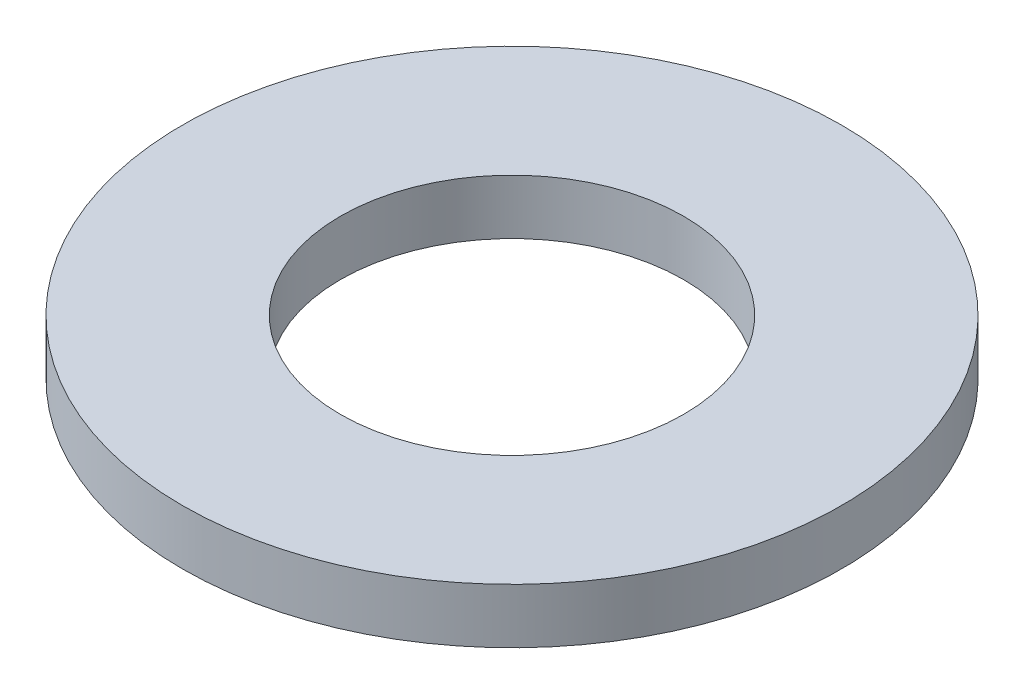
ISO-10303-21;
HEADER;
FILE_DESCRIPTION(('STEP AP214'),'2;1');
FILE_NAME('part.step','',(''),(''),'','','');
FILE_SCHEMA(('AUTOMOTIVE_DESIGN { 1 0 10303 214 1 1 1 1 }'));
ENDSEC;
DATA;
#1=APPLICATION_CONTEXT('core data for automotive mechanical design processes');
#2=APPLICATION_PROTOCOL_DEFINITION('international standard','automotive_design',2000,#1);
#3=PRODUCT_CONTEXT('',#1,'mechanical');
#4=PRODUCT('Part','Part','',(#3));
#5=PRODUCT_RELATED_PRODUCT_CATEGORY('part','',(#4));
#6=PRODUCT_DEFINITION_FORMATION('','',#4);
#7=PRODUCT_DEFINITION_CONTEXT('part definition',#1,'design');
#8=PRODUCT_DEFINITION('design','',#6,#7);
#9=PRODUCT_DEFINITION_SHAPE('','',#8);
#10=(LENGTH_UNIT() NAMED_UNIT(*) SI_UNIT(.MILLI.,.METRE.));
#11=(NAMED_UNIT(*) PLANE_ANGLE_UNIT() SI_UNIT($,.RADIAN.));
#12=(NAMED_UNIT(*) SI_UNIT($,.STERADIAN.) SOLID_ANGLE_UNIT());
#13=UNCERTAINTY_MEASURE_WITH_UNIT(LENGTH_MEASURE(1.E-05),#10,'distance_accuracy_value','');
#14=(GEOMETRIC_REPRESENTATION_CONTEXT(3) GLOBAL_UNCERTAINTY_ASSIGNED_CONTEXT((#13)) GLOBAL_UNIT_ASSIGNED_CONTEXT((#10,
#11,#12)) REPRESENTATION_CONTEXT('',''));
#15=CARTESIAN_POINT('',(0.,0.,0.));
#16=DIRECTION('',(0.,0.,1.));
#17=DIRECTION('',(1.,0.,0.));
#18=AXIS2_PLACEMENT_3D('',#15,#16,#17);
#19=CARTESIAN_POINT('',(0.,1.,0.));
#20=DIRECTION('',(0.,1.,0.));
#21=DIRECTION('',(0.,0.,1.));
#22=AXIS2_PLACEMENT_3D('',#19,#20,#21);
#23=PLANE('',#22);
#24=CARTESIAN_POINT('',(0.,1.,0.));
#25=DIRECTION('',(0.,1.,0.));
#26=DIRECTION('',(0.,0.,1.));
#27=AXIS2_PLACEMENT_3D('',#24,#25,#26);
#28=CIRCLE('',#27,6.);
#29=CARTESIAN_POINT('',(0.,1.,6.));
#30=VERTEX_POINT('',#29);
#31=EDGE_CURVE('E10',#30,#30,#28,.T.);
#32=ORIENTED_EDGE('',*,*,#31,.T.);
#33=EDGE_LOOP('',(#32));
#34=FACE_BOUND('',#33,.T.);
#35=CARTESIAN_POINT('',(0.,1.,0.));
#36=DIRECTION('',(0.,1.,0.));
#37=DIRECTION('',(0.,0.,1.));
#38=AXIS2_PLACEMENT_3D('',#35,#36,#37);
#39=CIRCLE('',#38,3.125);
#40=CARTESIAN_POINT('',(0.,1.,3.125));
#41=VERTEX_POINT('',#40);
#42=EDGE_CURVE('E56',#41,#41,#39,.T.);
#43=ORIENTED_EDGE('',*,*,#42,.F.);
#44=EDGE_LOOP('',(#43));
#45=FACE_BOUND('',#44,.T.);
#46=ADVANCED_FACE('F43',(#34,#45),#23,.T.);
#47=CARTESIAN_POINT('',(0.,0.,0.));
#48=DIRECTION('',(0.,1.,0.));
#49=DIRECTION('',(0.,0.,1.));
#50=AXIS2_PLACEMENT_3D('',#47,#48,#49);
#51=PLANE('',#50);
#52=CARTESIAN_POINT('',(0.,0.,0.));
#53=DIRECTION('',(0.,1.,0.));
#54=DIRECTION('',(0.,0.,1.));
#55=AXIS2_PLACEMENT_3D('',#52,#53,#54);
#56=CIRCLE('',#55,6.);
#57=CARTESIAN_POINT('',(0.,0.,6.));
#58=VERTEX_POINT('',#57);
#59=EDGE_CURVE('E47',#58,#58,#56,.T.);
#60=ORIENTED_EDGE('',*,*,#59,.F.);
#61=EDGE_LOOP('',(#60));
#62=FACE_BOUND('',#61,.T.);
#63=CARTESIAN_POINT('',(0.,0.,0.));
#64=DIRECTION('',(0.,1.,0.));
#65=DIRECTION('',(0.,0.,1.));
#66=AXIS2_PLACEMENT_3D('',#63,#64,#65);
#67=CIRCLE('',#66,3.125);
#68=CARTESIAN_POINT('',(0.,0.,3.125));
#69=VERTEX_POINT('',#68);
#70=EDGE_CURVE('E58',#69,#69,#67,.T.);
#71=ORIENTED_EDGE('',*,*,#70,.T.);
#72=EDGE_LOOP('',(#71));
#73=FACE_BOUND('',#72,.T.);
#74=ADVANCED_FACE('F70',(#62,#73),#51,.F.);
#75=CARTESIAN_POINT('',(0.,1.,0.));
#76=DIRECTION('',(0.,-1.,0.));
#77=DIRECTION('',(0.,0.,-1.));
#78=AXIS2_PLACEMENT_3D('',#75,#76,#77);
#79=CYLINDRICAL_SURFACE('',#78,6.);
#80=ORIENTED_EDGE('',*,*,#31,.F.);
#81=EDGE_LOOP('',(#80));
#82=FACE_BOUND('',#81,.T.);
#83=ORIENTED_EDGE('',*,*,#59,.T.);
#84=EDGE_LOOP('',(#83));
#85=FACE_BOUND('',#84,.T.);
#86=ADVANCED_FACE('F45',(#82,#85),#79,.T.);
#87=CARTESIAN_POINT('',(0.,1.,0.));
#88=DIRECTION('',(0.,-1.,0.));
#89=DIRECTION('',(0.,0.,-1.));
#90=AXIS2_PLACEMENT_3D('',#87,#88,#89);
#91=CYLINDRICAL_SURFACE('',#90,3.125);
#92=ORIENTED_EDGE('',*,*,#42,.T.);
#93=EDGE_LOOP('',(#92));
#94=FACE_BOUND('',#93,.T.);
#95=ORIENTED_EDGE('',*,*,#70,.F.);
#96=EDGE_LOOP('',(#95));
#97=FACE_BOUND('',#96,.T.);
#98=ADVANCED_FACE('F66',(#94,#97),#91,.F.);
#99=CLOSED_SHELL('',(#46,#74,#86,#98));
#100=MANIFOLD_SOLID_BREP('B2',#99);
#101=ADVANCED_BREP_SHAPE_REPRESENTATION('',(#18,#100),#14);
#102=SHAPE_DEFINITION_REPRESENTATION(#9,#101);
ENDSEC;
END-ISO-10303-21;
